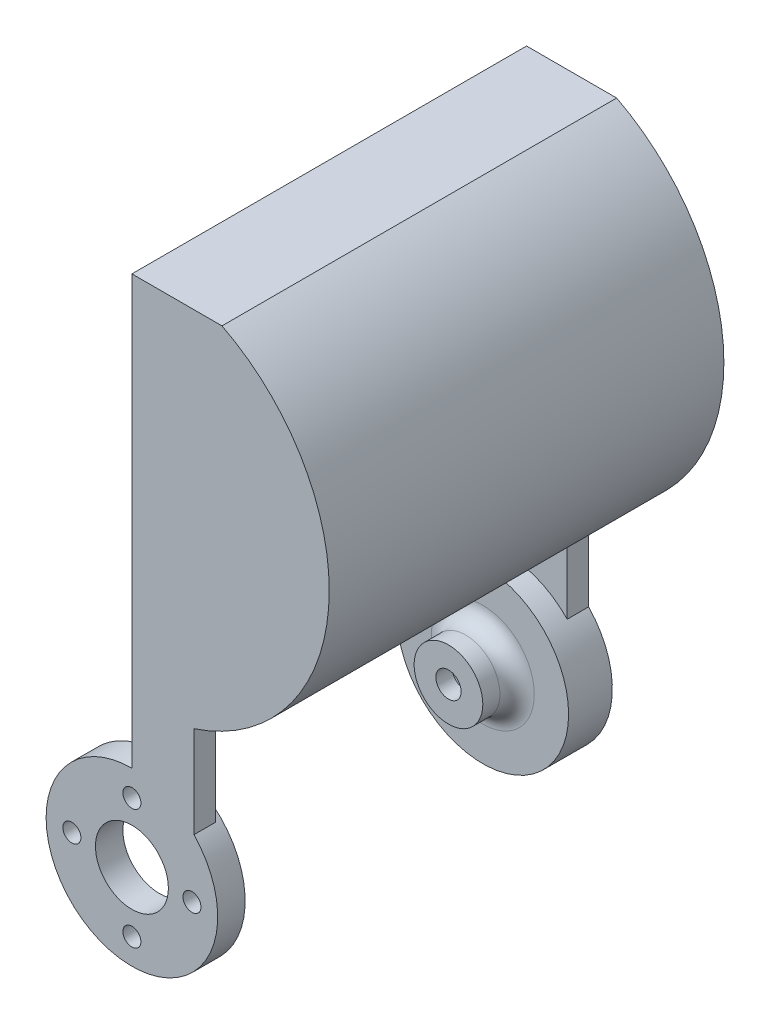
ISO-10303-21;
HEADER;
FILE_DESCRIPTION(('STEP AP214'),'2;1');
FILE_NAME('part.step','',(''),(''),'','','');
FILE_SCHEMA(('AUTOMOTIVE_DESIGN { 1 0 10303 214 1 1 1 1 }'));
ENDSEC;
DATA;
#1=APPLICATION_CONTEXT('core data for automotive mechanical design processes');
#2=APPLICATION_PROTOCOL_DEFINITION('international standard','automotive_design',2000,#1);
#3=PRODUCT_CONTEXT('',#1,'mechanical');
#4=PRODUCT('Part','Part','',(#3));
#5=PRODUCT_RELATED_PRODUCT_CATEGORY('part','',(#4));
#6=PRODUCT_DEFINITION_FORMATION('','',#4);
#7=PRODUCT_DEFINITION_CONTEXT('part definition',#1,'design');
#8=PRODUCT_DEFINITION('design','',#6,#7);
#9=PRODUCT_DEFINITION_SHAPE('','',#8);
#10=(LENGTH_UNIT() NAMED_UNIT(*) SI_UNIT(.MILLI.,.METRE.));
#11=(NAMED_UNIT(*) PLANE_ANGLE_UNIT() SI_UNIT($,.RADIAN.));
#12=(NAMED_UNIT(*) SI_UNIT($,.STERADIAN.) SOLID_ANGLE_UNIT());
#13=UNCERTAINTY_MEASURE_WITH_UNIT(LENGTH_MEASURE(1.E-05),#10,'distance_accuracy_value','');
#14=(GEOMETRIC_REPRESENTATION_CONTEXT(3) GLOBAL_UNCERTAINTY_ASSIGNED_CONTEXT((#13)) GLOBAL_UNIT_ASSIGNED_CONTEXT((#10,
#11,#12)) REPRESENTATION_CONTEXT('',''));
#15=CARTESIAN_POINT('',(0.,0.,0.));
#16=DIRECTION('',(0.,0.,1.));
#17=DIRECTION('',(1.,0.,0.));
#18=AXIS2_PLACEMENT_3D('',#15,#16,#17);
#19=CARTESIAN_POINT('',(0.,0.,23.));
#20=DIRECTION('',(0.,0.,-1.));
#21=DIRECTION('',(-1.,0.,0.));
#22=AXIS2_PLACEMENT_3D('',#19,#20,#21);
#23=CYLINDRICAL_SURFACE('',#22,10.);
#24=DIRECTION('',(0.,0.,-1.));
#25=VECTOR('',#24,1.);
#26=CARTESIAN_POINT('',(7.23431168174914,6.90396512819321,23.));
#27=LINE('',#26,#25);
#28=CARTESIAN_POINT('',(7.23431168174914,6.90396512819321,-20.5));
#29=VERTEX_POINT('',#28);
#30=CARTESIAN_POINT('',(7.23431168174914,6.90396512819321,-23.));
#31=VERTEX_POINT('',#30);
#32=EDGE_CURVE('E158',#29,#31,#27,.T.);
#33=ORIENTED_EDGE('',*,*,#32,.F.);
#34=CARTESIAN_POINT('',(0.,0.,-20.5));
#35=DIRECTION('',(0.,0.,1.));
#36=DIRECTION('',(1.,0.,0.));
#37=AXIS2_PLACEMENT_3D('',#34,#35,#36);
#38=CIRCLE('',#37,10.);
#39=CARTESIAN_POINT('',(0.,10.,-20.5));
#40=VERTEX_POINT('',#39);
#41=EDGE_CURVE('E141',#29,#40,#38,.T.);
#42=ORIENTED_EDGE('',*,*,#41,.T.);
#43=DIRECTION('',(0.,0.,-1.));
#44=VECTOR('',#43,1.);
#45=CARTESIAN_POINT('',(0.,10.,23.));
#46=LINE('',#45,#44);
#47=CARTESIAN_POINT('',(0.,10.,-23.));
#48=VERTEX_POINT('',#47);
#49=EDGE_CURVE('E171',#40,#48,#46,.T.);
#50=ORIENTED_EDGE('',*,*,#49,.T.);
#51=CARTESIAN_POINT('',(0.,0.,-23.));
#52=DIRECTION('',(0.,0.,1.));
#53=DIRECTION('',(1.,0.,0.));
#54=AXIS2_PLACEMENT_3D('',#51,#52,#53);
#55=CIRCLE('',#54,10.);
#56=EDGE_CURVE('E165',#48,#31,#55,.T.);
#57=ORIENTED_EDGE('',*,*,#56,.T.);
#58=EDGE_LOOP('',(#33,#42,#50,#57));
#59=FACE_BOUND('',#58,.T.);
#60=CARTESIAN_POINT('',(0.,0.,-17.9));
#61=DIRECTION('',(0.,0.,1.));
#62=DIRECTION('',(1.,0.,0.));
#63=AXIS2_PLACEMENT_3D('',#60,#61,#62);
#64=CIRCLE('',#63,10.);
#65=CARTESIAN_POINT('',(10.,0.,-17.9));
#66=VERTEX_POINT('',#65);
#67=EDGE_CURVE('E596',#66,#66,#64,.T.);
#68=ORIENTED_EDGE('',*,*,#67,.F.);
#69=EDGE_LOOP('',(#68));
#70=FACE_BOUND('',#69,.T.);
#71=ADVANCED_FACE('F45',(#59,#70),#23,.T.);
#72=CARTESIAN_POINT('',(0.,0.,-15.8));
#73=DIRECTION('',(0.,0.,-1.));
#74=DIRECTION('',(-1.,0.,0.));
#75=AXIS2_PLACEMENT_3D('',#72,#73,#74);
#76=CYLINDRICAL_SURFACE('',#75,3.);
#77=CARTESIAN_POINT('',(0.,0.,-15.8));
#78=DIRECTION('',(0.,0.,-1.));
#79=DIRECTION('',(-1.,0.,0.));
#80=AXIS2_PLACEMENT_3D('',#77,#78,#79);
#81=CIRCLE('',#80,3.);
#82=CARTESIAN_POINT('',(-3.,0.,-15.8));
#83=VERTEX_POINT('',#82);
#84=EDGE_CURVE('E585',#83,#83,#81,.T.);
#85=ORIENTED_EDGE('',*,*,#84,.F.);
#86=EDGE_LOOP('',(#85));
#87=FACE_BOUND('',#86,.T.);
#88=CARTESIAN_POINT('',(0.,0.,-19.));
#89=DIRECTION('',(0.,0.,-1.));
#90=DIRECTION('',(-1.,0.,0.));
#91=AXIS2_PLACEMENT_3D('',#88,#89,#90);
#92=CIRCLE('',#91,3.);
#93=CARTESIAN_POINT('',(-3.,0.,-19.));
#94=VERTEX_POINT('',#93);
#95=EDGE_CURVE('E187',#94,#94,#92,.F.);
#96=ORIENTED_EDGE('',*,*,#95,.F.);
#97=EDGE_LOOP('',(#96));
#98=FACE_BOUND('',#97,.T.);
#99=ADVANCED_FACE('F208',(#87,#98),#76,.F.);
#100=CARTESIAN_POINT('',(-10.,-18.2,-20.5));
#101=DIRECTION('',(0.,0.,-1.));
#102=DIRECTION('',(-1.,0.,0.));
#103=AXIS2_PLACEMENT_3D('',#100,#101,#102);
#104=PLANE('',#103);
#105=ORIENTED_EDGE('',*,*,#41,.F.);
#106=DIRECTION('',(0.,1.,0.));
#107=VECTOR('',#106,1.);
#108=CARTESIAN_POINT('',(7.23431168174914,0.,-20.5));
#109=LINE('',#108,#107);
#110=CARTESIAN_POINT('',(7.23431168174914,17.6039651281932,-20.5));
#111=VERTEX_POINT('',#110);
#112=EDGE_CURVE('E144',#29,#111,#109,.T.);
#113=ORIENTED_EDGE('',*,*,#112,.T.);
#114=CARTESIAN_POINT('',(0.,39.4366180703189,-20.5));
#115=DIRECTION('',(0.,0.,-1.));
#116=DIRECTION('',(-1.,0.,0.));
#117=AXIS2_PLACEMENT_3D('',#114,#115,#116);
#118=CIRCLE('',#117,23.);
#119=CARTESIAN_POINT('',(8.83210353966741,18.2,-20.5));
#120=VERTEX_POINT('',#119);
#121=EDGE_CURVE('E185',#120,#111,#118,.T.);
#122=ORIENTED_EDGE('',*,*,#121,.F.);
#123=DIRECTION('',(-1.,0.,0.));
#124=VECTOR('',#123,1.);
#125=CARTESIAN_POINT('',(-10.,18.2,-20.5));
#126=LINE('',#125,#124);
#127=CARTESIAN_POINT('',(0.,18.2,-20.5));
#128=VERTEX_POINT('',#127);
#129=EDGE_CURVE('E60',#120,#128,#126,.T.);
#130=ORIENTED_EDGE('',*,*,#129,.T.);
#131=DIRECTION('',(0.,-1.,0.));
#132=VECTOR('',#131,1.);
#133=CARTESIAN_POINT('',(0.,0.,-20.5));
#134=LINE('',#133,#132);
#135=EDGE_CURVE('E147',#128,#40,#134,.T.);
#136=ORIENTED_EDGE('',*,*,#135,.T.);
#137=EDGE_LOOP('',(#105,#113,#122,#130,#136));
#138=FACE_BOUND('',#137,.T.);
#139=ADVANCED_FACE('F143',(#138),#104,.F.);
#140=CARTESIAN_POINT('',(7.23431168174914,0.,23.));
#141=DIRECTION('',(1.,0.,0.));
#142=DIRECTION('',(0.,1.,0.));
#143=AXIS2_PLACEMENT_3D('',#140,#141,#142);
#144=PLANE('',#143);
#145=ORIENTED_EDGE('',*,*,#112,.F.);
#146=ORIENTED_EDGE('',*,*,#32,.T.);
#147=DIRECTION('',(0.,-1.,0.));
#148=VECTOR('',#147,1.);
#149=CARTESIAN_POINT('',(7.23431168174914,0.,-23.));
#150=LINE('',#149,#148);
#151=CARTESIAN_POINT('',(7.23431168174914,17.6039651281932,-23.));
#152=VERTEX_POINT('',#151);
#153=EDGE_CURVE('E289',#152,#31,#150,.T.);
#154=ORIENTED_EDGE('',*,*,#153,.F.);
#155=DIRECTION('',(0.,0.,-1.));
#156=VECTOR('',#155,1.);
#157=CARTESIAN_POINT('',(7.23431168174914,17.6039651281932,23.));
#158=LINE('',#157,#156);
#159=EDGE_CURVE('E160',#111,#152,#158,.T.);
#160=ORIENTED_EDGE('',*,*,#159,.F.);
#161=EDGE_LOOP('',(#145,#146,#154,#160));
#162=FACE_BOUND('',#161,.T.);
#163=ADVANCED_FACE('F156',(#162),#144,.T.);
#164=CARTESIAN_POINT('',(25.9374608433439,44.925,23.));
#165=DIRECTION('',(0.5,0.866025403784439,0.));
#166=DIRECTION('',(-0.866025403784439,0.5,0.));
#167=AXIS2_PLACEMENT_3D('',#164,#165,#166);
#168=PLANE('',#167);
#169=DIRECTION('',(-0.866025403784439,0.5,0.));
#170=VECTOR('',#169,1.);
#171=CARTESIAN_POINT('',(0.,59.9,-21.));
#172=LINE('',#171,#170);
#173=CARTESIAN_POINT('',(16.8891746608893,50.1490304631449,-21.));
#174=VERTEX_POINT('',#173);
#175=CARTESIAN_POINT('',(0.,59.9,-21.));
#176=VERTEX_POINT('',#175);
#177=EDGE_CURVE('E256',#174,#176,#172,.T.);
#178=ORIENTED_EDGE('',*,*,#177,.F.);
#179=DIRECTION('',(0.,0.,-1.));
#180=VECTOR('',#179,1.);
#181=CARTESIAN_POINT('',(16.8891746608893,50.1490304631449,23.));
#182=LINE('',#181,#180);
#183=CARTESIAN_POINT('',(16.8891746608893,50.1490304631449,21.));
#184=VERTEX_POINT('',#183);
#185=EDGE_CURVE('E298',#184,#174,#182,.T.);
#186=ORIENTED_EDGE('',*,*,#185,.F.);
#187=DIRECTION('',(-0.866025403784439,0.5,0.));
#188=VECTOR('',#187,1.);
#189=CARTESIAN_POINT('',(0.,59.9,21.));
#190=LINE('',#189,#188);
#191=CARTESIAN_POINT('',(0.,59.9,21.));
#192=VERTEX_POINT('',#191);
#193=EDGE_CURVE('E68',#184,#192,#190,.T.);
#194=ORIENTED_EDGE('',*,*,#193,.T.);
#195=DIRECTION('',(0.,0.,-1.));
#196=VECTOR('',#195,1.);
#197=CARTESIAN_POINT('',(0.,59.9,23.));
#198=LINE('',#197,#196);
#199=EDGE_CURVE('E301',#192,#176,#198,.T.);
#200=ORIENTED_EDGE('',*,*,#199,.T.);
#201=EDGE_LOOP('',(#178,#186,#194,#200));
#202=FACE_BOUND('',#201,.T.);
#203=ADVANCED_FACE('F317',(#202),#168,.F.);
#204=CARTESIAN_POINT('',(0.,39.4366180703189,23.));
#205=DIRECTION('',(0.,0.,-1.));
#206=DIRECTION('',(-1.,0.,0.));
#207=AXIS2_PLACEMENT_3D('',#204,#205,#206);
#208=CYLINDRICAL_SURFACE('',#207,20.);
#209=ORIENTED_EDGE('',*,*,#185,.T.);
#210=CARTESIAN_POINT('',(0.,39.4366180703189,-21.));
#211=DIRECTION('',(0.,0.,1.));
#212=DIRECTION('',(1.,0.,0.));
#213=AXIS2_PLACEMENT_3D('',#210,#211,#212);
#214=CIRCLE('',#213,20.);
#215=CARTESIAN_POINT('',(0.,19.4366180703189,-21.));
#216=VERTEX_POINT('',#215);
#217=EDGE_CURVE('E259',#216,#174,#214,.T.);
#218=ORIENTED_EDGE('',*,*,#217,.F.);
#219=DIRECTION('',(0.,0.,-1.));
#220=VECTOR('',#219,1.);
#221=CARTESIAN_POINT('',(0.,19.4366180703189,23.));
#222=LINE('',#221,#220);
#223=CARTESIAN_POINT('',(0.,19.4366180703189,21.));
#224=VERTEX_POINT('',#223);
#225=EDGE_CURVE('E286',#224,#216,#222,.T.);
#226=ORIENTED_EDGE('',*,*,#225,.F.);
#227=CARTESIAN_POINT('',(0.,39.4366180703189,21.));
#228=DIRECTION('',(0.,0.,1.));
#229=DIRECTION('',(1.,0.,0.));
#230=AXIS2_PLACEMENT_3D('',#227,#228,#229);
#231=CIRCLE('',#230,20.);
#232=EDGE_CURVE('E270',#224,#184,#231,.T.);
#233=ORIENTED_EDGE('',*,*,#232,.T.);
#234=EDGE_LOOP('',(#209,#218,#226,#233));
#235=FACE_BOUND('',#234,.T.);
#236=ADVANCED_FACE('F230',(#235),#208,.F.);
#237=CARTESIAN_POINT('',(0.,0.,23.));
#238=DIRECTION('',(-1.,0.,0.));
#239=DIRECTION('',(0.,0.,1.));
#240=AXIS2_PLACEMENT_3D('',#237,#238,#239);
#241=PLANE('',#240);
#242=ORIENTED_EDGE('',*,*,#135,.F.);
#243=DIRECTION('',(0.,0.,-1.));
#244=VECTOR('',#243,1.);
#245=CARTESIAN_POINT('',(0.,18.2,23.));
#246=LINE('',#245,#244);
#247=CARTESIAN_POINT('',(0.,18.2,20.5));
#248=VERTEX_POINT('',#247);
#249=EDGE_CURVE('E249',#248,#128,#246,.T.);
#250=ORIENTED_EDGE('',*,*,#249,.F.);
#251=DIRECTION('',(0.,1.,0.));
#252=VECTOR('',#251,1.);
#253=CARTESIAN_POINT('',(0.,0.,20.5));
#254=LINE('',#253,#252);
#255=CARTESIAN_POINT('',(0.,10.,20.5));
#256=VERTEX_POINT('',#255);
#257=EDGE_CURVE('E161',#256,#248,#254,.T.);
#258=ORIENTED_EDGE('',*,*,#257,.F.);
#259=CARTESIAN_POINT('',(0.,10.,23.));
#260=VERTEX_POINT('',#259);
#261=EDGE_CURVE('E176',#260,#256,#46,.T.);
#262=ORIENTED_EDGE('',*,*,#261,.F.);
#263=DIRECTION('',(0.,1.,0.));
#264=VECTOR('',#263,1.);
#265=CARTESIAN_POINT('',(0.,0.,23.));
#266=LINE('',#265,#264);
#267=CARTESIAN_POINT('',(0.,59.9,23.));
#268=VERTEX_POINT('',#267);
#269=EDGE_CURVE('E273',#260,#268,#266,.T.);
#270=ORIENTED_EDGE('',*,*,#269,.T.);
#271=EDGE_CURVE('E302',#268,#192,#198,.T.);
#272=ORIENTED_EDGE('',*,*,#271,.T.);
#273=DIRECTION('',(0.,-1.,0.));
#274=VECTOR('',#273,1.);
#275=CARTESIAN_POINT('',(0.,59.9,21.));
#276=LINE('',#275,#274);
#277=EDGE_CURVE('E267',#192,#224,#276,.T.);
#278=ORIENTED_EDGE('',*,*,#277,.T.);
#279=ORIENTED_EDGE('',*,*,#225,.T.);
#280=DIRECTION('',(0.,-1.,0.));
#281=VECTOR('',#280,1.);
#282=CARTESIAN_POINT('',(0.,59.9,-21.));
#283=LINE('',#282,#281);
#284=EDGE_CURVE('E261',#176,#216,#283,.T.);
#285=ORIENTED_EDGE('',*,*,#284,.F.);
#286=DIRECTION('',(0.,0.,-1.));
#287=VECTOR('',#286,1.);
#288=CARTESIAN_POINT('',(0.,59.9,-21.));
#289=LINE('',#288,#287);
#290=CARTESIAN_POINT('',(0.,59.9,-23.));
#291=VERTEX_POINT('',#290);
#292=EDGE_CURVE('E263',#176,#291,#289,.T.);
#293=ORIENTED_EDGE('',*,*,#292,.T.);
#294=DIRECTION('',(0.,1.,0.));
#295=VECTOR('',#294,1.);
#296=CARTESIAN_POINT('',(0.,0.,-23.));
#297=LINE('',#296,#295);
#298=EDGE_CURVE('E272',#48,#291,#297,.T.);
#299=ORIENTED_EDGE('',*,*,#298,.F.);
#300=ORIENTED_EDGE('',*,*,#49,.F.);
#301=EDGE_LOOP('',(#242,#250,#258,#262,#270,#272,#278,#279,#285,#293,#299,#300));
#302=FACE_BOUND('',#301,.T.);
#303=ADVANCED_FACE('F221',(#302),#241,.T.);
#304=ORIENTED_EDGE('',*,*,#261,.T.);
#305=CARTESIAN_POINT('',(0.,0.,20.5));
#306=DIRECTION('',(0.,0.,-1.));
#307=DIRECTION('',(-1.,0.,0.));
#308=AXIS2_PLACEMENT_3D('',#305,#306,#307);
#309=CIRCLE('',#308,10.);
#310=CARTESIAN_POINT('',(7.23431168174914,6.90396512819321,20.5));
#311=VERTEX_POINT('',#310);
#312=EDGE_CURVE('E239',#256,#311,#309,.T.);
#313=ORIENTED_EDGE('',*,*,#312,.T.);
#314=CARTESIAN_POINT('',(7.23431168174914,6.90396512819321,23.));
#315=VERTEX_POINT('',#314);
#316=EDGE_CURVE('E167',#315,#311,#27,.T.);
#317=ORIENTED_EDGE('',*,*,#316,.F.);
#318=CARTESIAN_POINT('',(0.,0.,23.));
#319=DIRECTION('',(0.,0.,1.));
#320=DIRECTION('',(1.,0.,0.));
#321=AXIS2_PLACEMENT_3D('',#318,#319,#320);
#322=CIRCLE('',#321,10.);
#323=EDGE_CURVE('E275',#260,#315,#322,.T.);
#324=ORIENTED_EDGE('',*,*,#323,.F.);
#325=EDGE_LOOP('',(#304,#313,#317,#324));
#326=FACE_BOUND('',#325,.T.);
#327=CARTESIAN_POINT('',(0.,0.,19.8));
#328=DIRECTION('',(0.,0.,-1.));
#329=DIRECTION('',(-1.,0.,0.));
#330=AXIS2_PLACEMENT_3D('',#327,#328,#329);
#331=CIRCLE('',#330,10.);
#332=CARTESIAN_POINT('',(-10.,0.,19.8));
#333=VERTEX_POINT('',#332);
#334=EDGE_CURVE('E236',#333,#333,#331,.T.);
#335=ORIENTED_EDGE('',*,*,#334,.F.);
#336=EDGE_LOOP('',(#335));
#337=FACE_BOUND('',#336,.T.);
#338=ADVANCED_FACE('F210',(#326,#337),#23,.T.);
#339=DIRECTION('',(0.,-1.,0.));
#340=VECTOR('',#339,1.);
#341=CARTESIAN_POINT('',(7.23431168174914,0.,20.5));
#342=LINE('',#341,#340);
#343=CARTESIAN_POINT('',(7.23431168174914,17.6039651281932,20.5));
#344=VERTEX_POINT('',#343);
#345=EDGE_CURVE('E251',#344,#311,#342,.T.);
#346=ORIENTED_EDGE('',*,*,#345,.F.);
#347=CARTESIAN_POINT('',(7.23431168174914,17.6039651281932,23.));
#348=VERTEX_POINT('',#347);
#349=EDGE_CURVE('E168',#348,#344,#158,.T.);
#350=ORIENTED_EDGE('',*,*,#349,.F.);
#351=DIRECTION('',(0.,-1.,0.));
#352=VECTOR('',#351,1.);
#353=CARTESIAN_POINT('',(7.23431168174914,0.,23.));
#354=LINE('',#353,#352);
#355=EDGE_CURVE('E278',#348,#315,#354,.T.);
#356=ORIENTED_EDGE('',*,*,#355,.T.);
#357=ORIENTED_EDGE('',*,*,#316,.T.);
#358=EDGE_LOOP('',(#346,#350,#356,#357));
#359=FACE_BOUND('',#358,.T.);
#360=ADVANCED_FACE('F220',(#359),#144,.T.);
#361=CARTESIAN_POINT('',(0.,39.4366180703189,23.));
#362=DIRECTION('',(0.,0.,-1.));
#363=DIRECTION('',(-1.,0.,0.));
#364=AXIS2_PLACEMENT_3D('',#361,#362,#363);
#365=CYLINDRICAL_SURFACE('',#364,23.);
#366=DIRECTION('',(0.,0.,-1.));
#367=VECTOR('',#366,1.);
#368=CARTESIAN_POINT('',(8.83210353966741,18.2,23.));
#369=LINE('',#368,#367);
#370=CARTESIAN_POINT('',(8.8321035396674,18.2,20.5));
#371=VERTEX_POINT('',#370);
#372=EDGE_CURVE('E179',#371,#120,#369,.T.);
#373=ORIENTED_EDGE('',*,*,#372,.T.);
#374=ORIENTED_EDGE('',*,*,#121,.T.);
#375=ORIENTED_EDGE('',*,*,#159,.T.);
#376=CARTESIAN_POINT('',(0.,39.4366180703189,-23.));
#377=DIRECTION('',(0.,0.,1.));
#378=DIRECTION('',(1.,0.,0.));
#379=AXIS2_PLACEMENT_3D('',#376,#377,#378);
#380=CIRCLE('',#379,23.);
#381=CARTESIAN_POINT('',(10.5,59.9,-23.));
#382=VERTEX_POINT('',#381);
#383=EDGE_CURVE('E291',#152,#382,#380,.T.);
#384=ORIENTED_EDGE('',*,*,#383,.T.);
#385=DIRECTION('',(0.,0.,-1.));
#386=VECTOR('',#385,1.);
#387=CARTESIAN_POINT('',(10.5,59.9,23.));
#388=LINE('',#387,#386);
#389=CARTESIAN_POINT('',(10.5,59.9,23.));
#390=VERTEX_POINT('',#389);
#391=EDGE_CURVE('E304',#390,#382,#388,.T.);
#392=ORIENTED_EDGE('',*,*,#391,.F.);
#393=CARTESIAN_POINT('',(0.,39.4366180703189,23.));
#394=DIRECTION('',(0.,0.,1.));
#395=DIRECTION('',(1.,0.,0.));
#396=AXIS2_PLACEMENT_3D('',#393,#394,#395);
#397=CIRCLE('',#396,23.);
#398=EDGE_CURVE('E281',#348,#390,#397,.T.);
#399=ORIENTED_EDGE('',*,*,#398,.F.);
#400=ORIENTED_EDGE('',*,*,#349,.T.);
#401=CARTESIAN_POINT('',(0.,39.4366180703189,20.5));
#402=DIRECTION('',(0.,0.,1.));
#403=DIRECTION('',(1.,0.,0.));
#404=AXIS2_PLACEMENT_3D('',#401,#402,#403);
#405=CIRCLE('',#404,23.);
#406=EDGE_CURVE('E182',#344,#371,#405,.T.);
#407=ORIENTED_EDGE('',*,*,#406,.T.);
#408=EDGE_LOOP('',(#373,#374,#375,#384,#392,#399,#400,#407));
#409=FACE_BOUND('',#408,.T.);
#410=ADVANCED_FACE('F227',(#409),#365,.T.);
#411=CARTESIAN_POINT('',(0.,59.9,23.));
#412=DIRECTION('',(0.,1.,0.));
#413=DIRECTION('',(0.,0.,1.));
#414=AXIS2_PLACEMENT_3D('',#411,#412,#413);
#415=PLANE('',#414);
#416=DIRECTION('',(1.,0.,0.));
#417=VECTOR('',#416,1.);
#418=CARTESIAN_POINT('',(0.,59.9,-23.));
#419=LINE('',#418,#417);
#420=EDGE_CURVE('E276',#291,#382,#419,.T.);
#421=ORIENTED_EDGE('',*,*,#420,.F.);
#422=ORIENTED_EDGE('',*,*,#292,.F.);
#423=ORIENTED_EDGE('',*,*,#199,.F.);
#424=ORIENTED_EDGE('',*,*,#271,.F.);
#425=DIRECTION('',(1.,0.,0.));
#426=VECTOR('',#425,1.);
#427=CARTESIAN_POINT('',(0.,59.9,23.));
#428=LINE('',#427,#426);
#429=EDGE_CURVE('E283',#268,#390,#428,.T.);
#430=ORIENTED_EDGE('',*,*,#429,.T.);
#431=ORIENTED_EDGE('',*,*,#391,.T.);
#432=EDGE_LOOP('',(#421,#422,#423,#424,#430,#431));
#433=FACE_BOUND('',#432,.T.);
#434=ADVANCED_FACE('F314',(#433),#415,.T.);
#435=CARTESIAN_POINT('',(0.,0.,23.));
#436=DIRECTION('',(0.,0.,1.));
#437=DIRECTION('',(1.,0.,0.));
#438=AXIS2_PLACEMENT_3D('',#435,#436,#437);
#439=PLANE('',#438);
#440=CARTESIAN_POINT('',(0.,7.,23.));
#441=DIRECTION('',(0.,0.,1.));
#442=DIRECTION('',(1.,0.,0.));
#443=AXIS2_PLACEMENT_3D('',#440,#441,#442);
#444=CIRCLE('',#443,1.05);
#445=CARTESIAN_POINT('',(1.05,7.,23.));
#446=VERTEX_POINT('',#445);
#447=EDGE_CURVE('E547',#446,#446,#444,.T.);
#448=ORIENTED_EDGE('',*,*,#447,.F.);
#449=EDGE_LOOP('',(#448));
#450=FACE_BOUND('',#449,.T.);
#451=CARTESIAN_POINT('',(-7.,0.,23.));
#452=DIRECTION('',(0.,0.,1.));
#453=DIRECTION('',(1.,0.,0.));
#454=AXIS2_PLACEMENT_3D('',#451,#452,#453);
#455=CIRCLE('',#454,1.05);
#456=CARTESIAN_POINT('',(-5.95,0.,23.));
#457=VERTEX_POINT('',#456);
#458=EDGE_CURVE('E568',#457,#457,#455,.T.);
#459=ORIENTED_EDGE('',*,*,#458,.F.);
#460=EDGE_LOOP('',(#459));
#461=FACE_BOUND('',#460,.T.);
#462=CARTESIAN_POINT('',(0.,-7.,23.));
#463=DIRECTION('',(0.,0.,1.));
#464=DIRECTION('',(1.,0.,0.));
#465=AXIS2_PLACEMENT_3D('',#462,#463,#464);
#466=CIRCLE('',#465,1.05);
#467=CARTESIAN_POINT('',(1.04999999999995,-7.,23.));
#468=VERTEX_POINT('',#467);
#469=EDGE_CURVE('E559',#468,#468,#466,.T.);
#470=ORIENTED_EDGE('',*,*,#469,.F.);
#471=EDGE_LOOP('',(#470));
#472=FACE_BOUND('',#471,.T.);
#473=CARTESIAN_POINT('',(7.,0.,23.));
#474=DIRECTION('',(0.,0.,1.));
#475=DIRECTION('',(1.,0.,0.));
#476=AXIS2_PLACEMENT_3D('',#473,#474,#475);
#477=CIRCLE('',#476,1.05);
#478=CARTESIAN_POINT('',(8.05,0.,23.));
#479=VERTEX_POINT('',#478);
#480=EDGE_CURVE('E548',#479,#479,#477,.T.);
#481=ORIENTED_EDGE('',*,*,#480,.F.);
#482=EDGE_LOOP('',(#481));
#483=FACE_BOUND('',#482,.T.);
#484=CARTESIAN_POINT('',(0.,0.,23.));
#485=DIRECTION('',(0.,0.,1.));
#486=DIRECTION('',(1.,0.,0.));
#487=AXIS2_PLACEMENT_3D('',#484,#485,#486);
#488=CIRCLE('',#487,4.25);
#489=CARTESIAN_POINT('',(4.25,0.,23.));
#490=VERTEX_POINT('',#489);
#491=EDGE_CURVE('E545',#490,#490,#488,.T.);
#492=ORIENTED_EDGE('',*,*,#491,.F.);
#493=EDGE_LOOP('',(#492));
#494=FACE_BOUND('',#493,.T.);
#495=ORIENTED_EDGE('',*,*,#269,.F.);
#496=ORIENTED_EDGE('',*,*,#323,.T.);
#497=ORIENTED_EDGE('',*,*,#355,.F.);
#498=ORIENTED_EDGE('',*,*,#398,.T.);
#499=ORIENTED_EDGE('',*,*,#429,.F.);
#500=EDGE_LOOP('',(#495,#496,#497,#498,#499));
#501=FACE_BOUND('',#500,.T.);
#502=ADVANCED_FACE('F328',(#450,#461,#472,#483,#494,#501),#439,.T.);
#503=CARTESIAN_POINT('',(0.,0.,-23.));
#504=DIRECTION('',(0.,0.,1.));
#505=DIRECTION('',(1.,0.,0.));
#506=AXIS2_PLACEMENT_3D('',#503,#504,#505);
#507=PLANE('',#506);
#508=CARTESIAN_POINT('',(0.,0.,-23.));
#509=DIRECTION('',(0.,0.,-1.));
#510=DIRECTION('',(-1.,0.,0.));
#511=AXIS2_PLACEMENT_3D('',#508,#509,#510);
#512=CIRCLE('',#511,5.);
#513=CARTESIAN_POINT('',(-5.,0.,-23.));
#514=VERTEX_POINT('',#513);
#515=EDGE_CURVE('E593',#514,#514,#512,.T.);
#516=ORIENTED_EDGE('',*,*,#515,.F.);
#517=EDGE_LOOP('',(#516));
#518=FACE_BOUND('',#517,.T.);
#519=ORIENTED_EDGE('',*,*,#298,.T.);
#520=ORIENTED_EDGE('',*,*,#420,.T.);
#521=ORIENTED_EDGE('',*,*,#383,.F.);
#522=ORIENTED_EDGE('',*,*,#153,.T.);
#523=ORIENTED_EDGE('',*,*,#56,.F.);
#524=EDGE_LOOP('',(#519,#520,#521,#522,#523));
#525=FACE_BOUND('',#524,.T.);
#526=ADVANCED_FACE('F311',(#518,#525),#507,.F.);
#527=CARTESIAN_POINT('',(0.,39.4366180703189,21.));
#528=DIRECTION('',(0.,0.,1.));
#529=DIRECTION('',(1.,0.,0.));
#530=AXIS2_PLACEMENT_3D('',#527,#528,#529);
#531=PLANE('',#530);
#532=ORIENTED_EDGE('',*,*,#193,.F.);
#533=ORIENTED_EDGE('',*,*,#232,.F.);
#534=ORIENTED_EDGE('',*,*,#277,.F.);
#535=EDGE_LOOP('',(#532,#533,#534));
#536=FACE_BOUND('',#535,.T.);
#537=ADVANCED_FACE('F324',(#536),#531,.F.);
#538=CARTESIAN_POINT('',(0.,39.4366180703189,-21.));
#539=DIRECTION('',(0.,0.,-1.));
#540=DIRECTION('',(1.,0.,0.));
#541=AXIS2_PLACEMENT_3D('',#538,#539,#540);
#542=PLANE('',#541);
#543=ORIENTED_EDGE('',*,*,#177,.T.);
#544=ORIENTED_EDGE('',*,*,#284,.T.);
#545=ORIENTED_EDGE('',*,*,#217,.T.);
#546=EDGE_LOOP('',(#543,#544,#545));
#547=FACE_BOUND('',#546,.T.);
#548=ADVANCED_FACE('F349',(#547),#542,.F.);
#549=CARTESIAN_POINT('',(-10.,-18.2,20.5));
#550=DIRECTION('',(0.,0.,1.));
#551=DIRECTION('',(1.,0.,0.));
#552=AXIS2_PLACEMENT_3D('',#549,#550,#551);
#553=PLANE('',#552);
#554=ORIENTED_EDGE('',*,*,#312,.F.);
#555=ORIENTED_EDGE('',*,*,#257,.T.);
#556=DIRECTION('',(1.,0.,0.));
#557=VECTOR('',#556,1.);
#558=CARTESIAN_POINT('',(-10.,18.2,20.5));
#559=LINE('',#558,#557);
#560=EDGE_CURVE('E238',#248,#371,#559,.T.);
#561=ORIENTED_EDGE('',*,*,#560,.T.);
#562=ORIENTED_EDGE('',*,*,#406,.F.);
#563=ORIENTED_EDGE('',*,*,#345,.T.);
#564=EDGE_LOOP('',(#554,#555,#561,#562,#563));
#565=FACE_BOUND('',#564,.T.);
#566=ADVANCED_FACE('F334',(#565),#553,.F.);
#567=CARTESIAN_POINT('',(0.,18.2,0.));
#568=DIRECTION('',(0.,1.,0.));
#569=DIRECTION('',(0.,0.,1.));
#570=AXIS2_PLACEMENT_3D('',#567,#568,#569);
#571=PLANE('',#570);
#572=ORIENTED_EDGE('',*,*,#249,.T.);
#573=ORIENTED_EDGE('',*,*,#129,.F.);
#574=ORIENTED_EDGE('',*,*,#372,.F.);
#575=ORIENTED_EDGE('',*,*,#560,.F.);
#576=EDGE_LOOP('',(#572,#573,#574,#575));
#577=FACE_BOUND('',#576,.T.);
#578=ADVANCED_FACE('F338',(#577),#571,.F.);
#579=CARTESIAN_POINT('',(0.,0.,19.8));
#580=DIRECTION('',(0.,0.,-1.));
#581=DIRECTION('',(-1.,0.,0.));
#582=AXIS2_PLACEMENT_3D('',#579,#580,#581);
#583=PLANE('',#582);
#584=CARTESIAN_POINT('',(0.,7.,19.8));
#585=DIRECTION('',(0.,0.,-1.));
#586=DIRECTION('',(-1.,0.,0.));
#587=AXIS2_PLACEMENT_3D('',#584,#585,#586);
#588=CIRCLE('',#587,1.05);
#589=CARTESIAN_POINT('',(-1.05,7.,19.8));
#590=VERTEX_POINT('',#589);
#591=EDGE_CURVE('E551',#590,#590,#588,.F.);
#592=ORIENTED_EDGE('',*,*,#591,.T.);
#593=EDGE_LOOP('',(#592));
#594=FACE_BOUND('',#593,.T.);
#595=CARTESIAN_POINT('',(-7.,0.,19.8));
#596=DIRECTION('',(0.,0.,-1.));
#597=DIRECTION('',(-1.,0.,0.));
#598=AXIS2_PLACEMENT_3D('',#595,#596,#597);
#599=CIRCLE('',#598,1.05);
#600=CARTESIAN_POINT('',(-8.05,0.,19.8));
#601=VERTEX_POINT('',#600);
#602=EDGE_CURVE('E151',#601,#601,#599,.F.);
#603=ORIENTED_EDGE('',*,*,#602,.T.);
#604=EDGE_LOOP('',(#603));
#605=FACE_BOUND('',#604,.T.);
#606=CARTESIAN_POINT('',(0.,-7.,19.8));
#607=DIRECTION('',(0.,0.,-1.));
#608=DIRECTION('',(-1.,0.,0.));
#609=AXIS2_PLACEMENT_3D('',#606,#607,#608);
#610=CIRCLE('',#609,1.05);
#611=CARTESIAN_POINT('',(-1.05000000000005,-7.,19.8));
#612=VERTEX_POINT('',#611);
#613=EDGE_CURVE('E563',#612,#612,#610,.F.);
#614=ORIENTED_EDGE('',*,*,#613,.T.);
#615=EDGE_LOOP('',(#614));
#616=FACE_BOUND('',#615,.T.);
#617=CARTESIAN_POINT('',(7.,0.,19.8));
#618=DIRECTION('',(0.,0.,-1.));
#619=DIRECTION('',(-1.,0.,0.));
#620=AXIS2_PLACEMENT_3D('',#617,#618,#619);
#621=CIRCLE('',#620,1.05);
#622=CARTESIAN_POINT('',(5.95,0.,19.8));
#623=VERTEX_POINT('',#622);
#624=EDGE_CURVE('E554',#623,#623,#621,.F.);
#625=ORIENTED_EDGE('',*,*,#624,.T.);
#626=EDGE_LOOP('',(#625));
#627=FACE_BOUND('',#626,.T.);
#628=ORIENTED_EDGE('',*,*,#334,.T.);
#629=EDGE_LOOP('',(#628));
#630=FACE_BOUND('',#629,.T.);
#631=CARTESIAN_POINT('',(0.,0.,19.8));
#632=DIRECTION('',(0.,0.,-1.));
#633=DIRECTION('',(-1.,0.,0.));
#634=AXIS2_PLACEMENT_3D('',#631,#632,#633);
#635=CIRCLE('',#634,4.25);
#636=CARTESIAN_POINT('',(-4.25,0.,19.8));
#637=VERTEX_POINT('',#636);
#638=EDGE_CURVE('E243',#637,#637,#635,.T.);
#639=ORIENTED_EDGE('',*,*,#638,.F.);
#640=EDGE_LOOP('',(#639));
#641=FACE_BOUND('',#640,.T.);
#642=ADVANCED_FACE('F339',(#594,#605,#616,#627,#630,#641),#583,.T.);
#643=CARTESIAN_POINT('',(0.,0.,19.8));
#644=DIRECTION('',(0.,0.,1.));
#645=DIRECTION('',(1.,0.,0.));
#646=AXIS2_PLACEMENT_3D('',#643,#644,#645);
#647=CYLINDRICAL_SURFACE('',#646,4.25);
#648=ORIENTED_EDGE('',*,*,#638,.T.);
#649=EDGE_LOOP('',(#648));
#650=FACE_BOUND('',#649,.T.);
#651=ORIENTED_EDGE('',*,*,#491,.T.);
#652=EDGE_LOOP('',(#651));
#653=FACE_BOUND('',#652,.T.);
#654=ADVANCED_FACE('F345',(#650,#653),#647,.F.);
#655=CARTESIAN_POINT('',(7.,0.,-23.001));
#656=DIRECTION('',(0.,0.,1.));
#657=DIRECTION('',(1.,0.,0.));
#658=AXIS2_PLACEMENT_3D('',#655,#656,#657);
#659=CYLINDRICAL_SURFACE('',#658,1.05);
#660=ORIENTED_EDGE('',*,*,#624,.F.);
#661=EDGE_LOOP('',(#660));
#662=FACE_BOUND('',#661,.T.);
#663=ORIENTED_EDGE('',*,*,#480,.T.);
#664=EDGE_LOOP('',(#663));
#665=FACE_BOUND('',#664,.T.);
#666=ADVANCED_FACE('F529',(#662,#665),#659,.F.);
#667=CARTESIAN_POINT('',(0.,-7.,-23.001));
#668=DIRECTION('',(0.,0.,1.));
#669=DIRECTION('',(1.,0.,0.));
#670=AXIS2_PLACEMENT_3D('',#667,#668,#669);
#671=CYLINDRICAL_SURFACE('',#670,1.05);
#672=ORIENTED_EDGE('',*,*,#613,.F.);
#673=EDGE_LOOP('',(#672));
#674=FACE_BOUND('',#673,.T.);
#675=ORIENTED_EDGE('',*,*,#469,.T.);
#676=EDGE_LOOP('',(#675));
#677=FACE_BOUND('',#676,.T.);
#678=ADVANCED_FACE('F526',(#674,#677),#671,.F.);
#679=CARTESIAN_POINT('',(-7.,0.,-23.001));
#680=DIRECTION('',(0.,0.,1.));
#681=DIRECTION('',(1.,0.,0.));
#682=AXIS2_PLACEMENT_3D('',#679,#680,#681);
#683=CYLINDRICAL_SURFACE('',#682,1.05);
#684=ORIENTED_EDGE('',*,*,#602,.F.);
#685=EDGE_LOOP('',(#684));
#686=FACE_BOUND('',#685,.T.);
#687=ORIENTED_EDGE('',*,*,#458,.T.);
#688=EDGE_LOOP('',(#687));
#689=FACE_BOUND('',#688,.T.);
#690=ADVANCED_FACE('F524',(#686,#689),#683,.F.);
#691=CARTESIAN_POINT('',(0.,7.,-23.001));
#692=DIRECTION('',(0.,0.,1.));
#693=DIRECTION('',(1.,0.,0.));
#694=AXIS2_PLACEMENT_3D('',#691,#692,#693);
#695=CYLINDRICAL_SURFACE('',#694,1.05);
#696=ORIENTED_EDGE('',*,*,#591,.F.);
#697=EDGE_LOOP('',(#696));
#698=FACE_BOUND('',#697,.T.);
#699=ORIENTED_EDGE('',*,*,#447,.T.);
#700=EDGE_LOOP('',(#699));
#701=FACE_BOUND('',#700,.T.);
#702=ADVANCED_FACE('F468',(#698,#701),#695,.F.);
#703=CARTESIAN_POINT('',(0.,0.,-13.9));
#704=DIRECTION('',(0.,0.,-1.));
#705=DIRECTION('',(-1.,0.,0.));
#706=AXIS2_PLACEMENT_3D('',#703,#704,#705);
#707=CYLINDRICAL_SURFACE('',#706,4.);
#708=CARTESIAN_POINT('',(0.,0.,-15.9));
#709=DIRECTION('',(0.,0.,1.));
#710=DIRECTION('',(1.,0.,0.));
#711=AXIS2_PLACEMENT_3D('',#708,#709,#710);
#712=CIRCLE('',#711,4.);
#713=CARTESIAN_POINT('',(4.,0.,-15.9));
#714=VERTEX_POINT('',#713);
#715=EDGE_CURVE('E53',#714,#714,#712,.T.);
#716=ORIENTED_EDGE('',*,*,#715,.T.);
#717=EDGE_LOOP('',(#716));
#718=FACE_BOUND('',#717,.T.);
#719=CARTESIAN_POINT('',(0.,0.,-13.9));
#720=DIRECTION('',(0.,0.,1.));
#721=DIRECTION('',(1.,0.,0.));
#722=AXIS2_PLACEMENT_3D('',#719,#720,#721);
#723=CIRCLE('',#722,4.);
#724=CARTESIAN_POINT('',(4.,0.,-13.9));
#725=VERTEX_POINT('',#724);
#726=EDGE_CURVE('E152',#725,#725,#723,.T.);
#727=ORIENTED_EDGE('',*,*,#726,.F.);
#728=EDGE_LOOP('',(#727));
#729=FACE_BOUND('',#728,.T.);
#730=ADVANCED_FACE('F194',(#718,#729),#707,.T.);
#731=CARTESIAN_POINT('',(0.,0.,-13.9));
#732=DIRECTION('',(0.,0.,1.));
#733=DIRECTION('',(1.,0.,0.));
#734=AXIS2_PLACEMENT_3D('',#731,#732,#733);
#735=PLANE('',#734);
#736=CARTESIAN_POINT('',(0.,0.,-13.9));
#737=DIRECTION('',(0.,0.,1.));
#738=DIRECTION('',(1.,0.,0.));
#739=AXIS2_PLACEMENT_3D('',#736,#737,#738);
#740=CIRCLE('',#739,1.475);
#741=CARTESIAN_POINT('',(1.475,0.,-13.9));
#742=VERTEX_POINT('',#741);
#743=EDGE_CURVE('E588',#742,#742,#740,.F.);
#744=ORIENTED_EDGE('',*,*,#743,.T.);
#745=EDGE_LOOP('',(#744));
#746=FACE_BOUND('',#745,.T.);
#747=ORIENTED_EDGE('',*,*,#726,.T.);
#748=EDGE_LOOP('',(#747));
#749=FACE_BOUND('',#748,.T.);
#750=ADVANCED_FACE('F467',(#746,#749),#735,.T.);
#751=CARTESIAN_POINT('',(0.,0.,-15.8));
#752=DIRECTION('',(0.,0.,-1.));
#753=DIRECTION('',(-1.,0.,0.));
#754=AXIS2_PLACEMENT_3D('',#751,#752,#753);
#755=PLANE('',#754);
#756=CARTESIAN_POINT('',(0.,0.,-15.8));
#757=DIRECTION('',(0.,0.,-1.));
#758=DIRECTION('',(-1.,0.,0.));
#759=AXIS2_PLACEMENT_3D('',#756,#757,#758);
#760=CIRCLE('',#759,1.475);
#761=CARTESIAN_POINT('',(-1.475,0.,-15.8));
#762=VERTEX_POINT('',#761);
#763=EDGE_CURVE('E189',#762,#762,#760,.F.);
#764=ORIENTED_EDGE('',*,*,#763,.T.);
#765=EDGE_LOOP('',(#764));
#766=FACE_BOUND('',#765,.T.);
#767=ORIENTED_EDGE('',*,*,#84,.T.);
#768=EDGE_LOOP('',(#767));
#769=FACE_BOUND('',#768,.T.);
#770=ADVANCED_FACE('F494',(#766,#769),#755,.T.);
#771=CARTESIAN_POINT('',(0.,0.,23.001));
#772=DIRECTION('',(0.,0.,-1.));
#773=DIRECTION('',(-1.,0.,0.));
#774=AXIS2_PLACEMENT_3D('',#771,#772,#773);
#775=CYLINDRICAL_SURFACE('',#774,1.475);
#776=ORIENTED_EDGE('',*,*,#743,.F.);
#777=EDGE_LOOP('',(#776));
#778=FACE_BOUND('',#777,.T.);
#779=ORIENTED_EDGE('',*,*,#763,.F.);
#780=EDGE_LOOP('',(#779));
#781=FACE_BOUND('',#780,.T.);
#782=ADVANCED_FACE('F439',(#778,#781),#775,.F.);
#783=CARTESIAN_POINT('',(0.,0.,-19.));
#784=DIRECTION('',(0.,0.,-1.));
#785=DIRECTION('',(-1.,0.,0.));
#786=AXIS2_PLACEMENT_3D('',#783,#784,#785);
#787=PLANE('',#786);
#788=CARTESIAN_POINT('',(0.,0.,-19.));
#789=DIRECTION('',(0.,0.,-1.));
#790=DIRECTION('',(-1.,0.,0.));
#791=AXIS2_PLACEMENT_3D('',#788,#789,#790);
#792=CIRCLE('',#791,5.);
#793=CARTESIAN_POINT('',(-5.,0.,-19.));
#794=VERTEX_POINT('',#793);
#795=EDGE_CURVE('E190',#794,#794,#792,.T.);
#796=ORIENTED_EDGE('',*,*,#795,.T.);
#797=EDGE_LOOP('',(#796));
#798=FACE_BOUND('',#797,.T.);
#799=ORIENTED_EDGE('',*,*,#95,.T.);
#800=EDGE_LOOP('',(#799));
#801=FACE_BOUND('',#800,.T.);
#802=ADVANCED_FACE('F436',(#798,#801),#787,.T.);
#803=CARTESIAN_POINT('',(0.,0.,-19.));
#804=DIRECTION('',(0.,0.,-1.));
#805=DIRECTION('',(-1.,0.,0.));
#806=AXIS2_PLACEMENT_3D('',#803,#804,#805);
#807=CYLINDRICAL_SURFACE('',#806,5.);
#808=ORIENTED_EDGE('',*,*,#795,.F.);
#809=EDGE_LOOP('',(#808));
#810=FACE_BOUND('',#809,.T.);
#811=ORIENTED_EDGE('',*,*,#515,.T.);
#812=EDGE_LOOP('',(#811));
#813=FACE_BOUND('',#812,.T.);
#814=ADVANCED_FACE('F203',(#810,#813),#807,.F.);
#815=CARTESIAN_POINT('',(0.,0.,-17.9));
#816=DIRECTION('',(0.,0.,1.));
#817=DIRECTION('',(1.,0.,0.));
#818=AXIS2_PLACEMENT_3D('',#815,#816,#817);
#819=PLANE('',#818);
#820=CARTESIAN_POINT('',(0.,0.,-17.9));
#821=DIRECTION('',(0.,0.,1.));
#822=DIRECTION('',(1.,0.,0.));
#823=AXIS2_PLACEMENT_3D('',#820,#821,#822);
#824=CIRCLE('',#823,6.);
#825=CARTESIAN_POINT('',(6.,0.,-17.9));
#826=VERTEX_POINT('',#825);
#827=EDGE_CURVE('E11',#826,#826,#824,.F.);
#828=ORIENTED_EDGE('',*,*,#827,.T.);
#829=EDGE_LOOP('',(#828));
#830=FACE_BOUND('',#829,.T.);
#831=ORIENTED_EDGE('',*,*,#67,.T.);
#832=EDGE_LOOP('',(#831));
#833=FACE_BOUND('',#832,.T.);
#834=ADVANCED_FACE('F198',(#830,#833),#819,.T.);
#835=CARTESIAN_POINT('',(0.,0.,-15.9));
#836=DIRECTION('',(0.,0.,1.));
#837=DIRECTION('',(1.,0.,0.));
#838=AXIS2_PLACEMENT_3D('',#835,#836,#837);
#839=TOROIDAL_SURFACE('',#838,6.,2.);
#840=ORIENTED_EDGE('',*,*,#827,.F.);
#841=EDGE_LOOP('',(#840));
#842=FACE_BOUND('',#841,.T.);
#843=ORIENTED_EDGE('',*,*,#715,.F.);
#844=EDGE_LOOP('',(#843));
#845=FACE_BOUND('',#844,.T.);
#846=ADVANCED_FACE('F47',(#842,#845),#839,.F.);
#847=CLOSED_SHELL('',(#71,#99,#139,#163,#203,#236,#303,#338,#360,#410,#434,#502,#526,#537,#548,
#566,#578,#642,#654,#666,#678,#690,#702,#730,#750,#770,#782,#802,#814,#834,#846));
#848=MANIFOLD_SOLID_BREP('B2',#847);
#849=ADVANCED_BREP_SHAPE_REPRESENTATION('',(#18,#848),#14);
#850=SHAPE_DEFINITION_REPRESENTATION(#9,#849);
ENDSEC;
END-ISO-10303-21;
